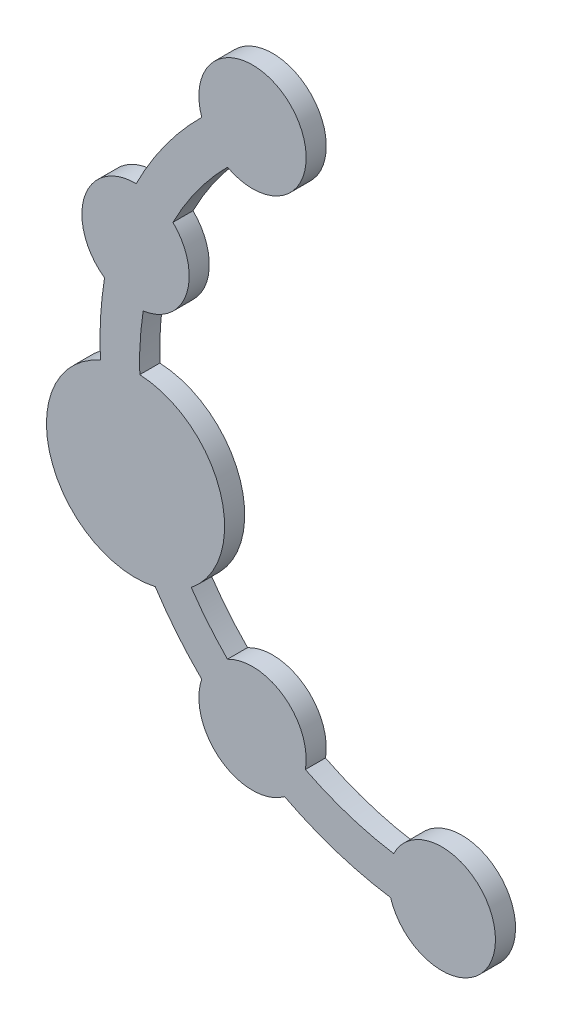
ISO-10303-21;
HEADER;
FILE_DESCRIPTION(('STEP AP214'),'2;1');
FILE_NAME('part.step','',(''),(''),'','','');
FILE_SCHEMA(('AUTOMOTIVE_DESIGN { 1 0 10303 214 1 1 1 1 }'));
ENDSEC;
DATA;
#1=APPLICATION_CONTEXT('core data for automotive mechanical design processes');
#2=APPLICATION_PROTOCOL_DEFINITION('international standard','automotive_design',2000,#1);
#3=PRODUCT_CONTEXT('',#1,'mechanical');
#4=PRODUCT('Part','Part','',(#3));
#5=PRODUCT_RELATED_PRODUCT_CATEGORY('part','',(#4));
#6=PRODUCT_DEFINITION_FORMATION('','',#4);
#7=PRODUCT_DEFINITION_CONTEXT('part definition',#1,'design');
#8=PRODUCT_DEFINITION('design','',#6,#7);
#9=PRODUCT_DEFINITION_SHAPE('','',#8);
#10=(LENGTH_UNIT() NAMED_UNIT(*) SI_UNIT(.MILLI.,.METRE.));
#11=(NAMED_UNIT(*) PLANE_ANGLE_UNIT() SI_UNIT($,.RADIAN.));
#12=(NAMED_UNIT(*) SI_UNIT($,.STERADIAN.) SOLID_ANGLE_UNIT());
#13=UNCERTAINTY_MEASURE_WITH_UNIT(LENGTH_MEASURE(1.E-05),#10,'distance_accuracy_value','');
#14=(GEOMETRIC_REPRESENTATION_CONTEXT(3) GLOBAL_UNCERTAINTY_ASSIGNED_CONTEXT((#13)) GLOBAL_UNIT_ASSIGNED_CONTEXT((#10,
#11,#12)) REPRESENTATION_CONTEXT('',''));
#15=CARTESIAN_POINT('',(0.,0.,0.));
#16=DIRECTION('',(0.,0.,1.));
#17=DIRECTION('',(1.,0.,0.));
#18=AXIS2_PLACEMENT_3D('',#15,#16,#17);
#19=CARTESIAN_POINT('',(0.,0.,0.));
#20=DIRECTION('',(0.,0.,1.));
#21=DIRECTION('',(1.,0.,0.));
#22=AXIS2_PLACEMENT_3D('',#19,#20,#21);
#23=CYLINDRICAL_SURFACE('',#22,30.5299999999999);
#24=CARTESIAN_POINT('',(0.,0.,0.));
#25=DIRECTION('',(0.,0.,-1.));
#26=DIRECTION('',(-1.,0.,0.));
#27=AXIS2_PLACEMENT_3D('',#24,#25,#26);
#28=CIRCLE('',#27,30.5299999999999);
#29=CARTESIAN_POINT('',(-27.1615635298566,13.9402427028211,0.));
#30=VERTEX_POINT('',#29);
#31=CARTESIAN_POINT('',(-21.6513433857743,21.5244100869521,0.));
#32=VERTEX_POINT('',#31);
#33=EDGE_CURVE('E188',#30,#32,#28,.T.);
#34=ORIENTED_EDGE('',*,*,#33,.T.);
#35=DIRECTION('',(0.,0.,-1.));
#36=VECTOR('',#35,1.);
#37=CARTESIAN_POINT('',(-21.6513433857743,21.5244100869521,1.015));
#38=LINE('',#37,#36);
#39=CARTESIAN_POINT('',(-21.6513433857743,21.5244100869521,2.03));
#40=VERTEX_POINT('',#39);
#41=EDGE_CURVE('E49',#32,#40,#38,.F.);
#42=ORIENTED_EDGE('',*,*,#41,.T.);
#43=CARTESIAN_POINT('',(0.,0.,2.03));
#44=DIRECTION('',(0.,0.,-1.));
#45=DIRECTION('',(-1.,0.,0.));
#46=AXIS2_PLACEMENT_3D('',#43,#44,#45);
#47=CIRCLE('',#46,30.5299999999999);
#48=CARTESIAN_POINT('',(-27.1615635298566,13.9402427028211,2.03));
#49=VERTEX_POINT('',#48);
#50=EDGE_CURVE('E173',#49,#40,#47,.T.);
#51=ORIENTED_EDGE('',*,*,#50,.F.);
#52=DIRECTION('',(0.,0.,-1.));
#53=VECTOR('',#52,1.);
#54=CARTESIAN_POINT('',(-27.1615635298566,13.9402427028211,1.015));
#55=LINE('',#54,#53);
#56=EDGE_CURVE('E208',#49,#30,#55,.T.);
#57=ORIENTED_EDGE('',*,*,#56,.T.);
#58=EDGE_LOOP('',(#34,#42,#51,#57));
#59=FACE_BOUND('',#58,.T.);
#60=ADVANCED_FACE('F34',(#59),#23,.F.);
#61=CARTESIAN_POINT('',(0.,0.,0.));
#62=DIRECTION('',(0.,0.,1.));
#63=DIRECTION('',(1.,0.,0.));
#64=AXIS2_PLACEMENT_3D('',#61,#62,#63);
#65=CYLINDRICAL_SURFACE('',#64,34.5300000000001);
#66=CARTESIAN_POINT('',(0.,0.,2.03));
#67=DIRECTION('',(0.,0.,1.));
#68=DIRECTION('',(-1.,0.,0.));
#69=AXIS2_PLACEMENT_3D('',#66,#67,#68);
#70=CIRCLE('',#69,34.5300000000001);
#71=CARTESIAN_POINT('',(-24.2539232103897,24.5777970718396,2.03));
#72=VERTEX_POINT('',#71);
#73=CARTESIAN_POINT('',(-30.8697485136282,15.4718947354664,2.03));
#74=VERTEX_POINT('',#73);
#75=EDGE_CURVE('E57',#72,#74,#70,.T.);
#76=ORIENTED_EDGE('',*,*,#75,.F.);
#77=DIRECTION('',(0.,0.,-1.));
#78=VECTOR('',#77,1.);
#79=CARTESIAN_POINT('',(-24.2539232103896,24.5777970718396,1.015));
#80=LINE('',#79,#78);
#81=CARTESIAN_POINT('',(-24.2539232103897,24.5777970718396,0.));
#82=VERTEX_POINT('',#81);
#83=EDGE_CURVE('E280',#72,#82,#80,.T.);
#84=ORIENTED_EDGE('',*,*,#83,.T.);
#85=CARTESIAN_POINT('',(0.,0.,0.));
#86=DIRECTION('',(0.,0.,1.));
#87=DIRECTION('',(-1.,0.,0.));
#88=AXIS2_PLACEMENT_3D('',#85,#86,#87);
#89=CIRCLE('',#88,34.5300000000001);
#90=CARTESIAN_POINT('',(-30.8697485136282,15.4718947354664,0.));
#91=VERTEX_POINT('',#90);
#92=EDGE_CURVE('E232',#82,#91,#89,.T.);
#93=ORIENTED_EDGE('',*,*,#92,.T.);
#94=DIRECTION('',(0.,0.,-1.));
#95=VECTOR('',#94,1.);
#96=CARTESIAN_POINT('',(-30.8697485136282,15.4718947354664,1.015));
#97=LINE('',#96,#95);
#98=EDGE_CURVE('E209',#91,#74,#97,.F.);
#99=ORIENTED_EDGE('',*,*,#98,.T.);
#100=EDGE_LOOP('',(#76,#84,#93,#99));
#101=FACE_BOUND('',#100,.T.);
#102=ADVANCED_FACE('F296',(#101),#65,.T.);
#103=DIRECTION('',(0.,0.,1.));
#104=VECTOR('',#103,1.);
#105=CARTESIAN_POINT('',(-30.5115084468974,-1.06242754807366,1.015));
#106=LINE('',#105,#104);
#107=CARTESIAN_POINT('',(-30.5115084468974,-1.06242754807366,0.));
#108=VERTEX_POINT('',#107);
#109=CARTESIAN_POINT('',(-30.5115084468974,-1.06242754807366,2.03));
#110=VERTEX_POINT('',#109);
#111=EDGE_CURVE('E146',#108,#110,#106,.T.);
#112=ORIENTED_EDGE('',*,*,#111,.F.);
#113=CARTESIAN_POINT('',(-30.1680355635448,4.68727321976142,0.));
#114=VERTEX_POINT('',#113);
#115=EDGE_CURVE('E231',#108,#114,#28,.T.);
#116=ORIENTED_EDGE('',*,*,#115,.T.);
#117=DIRECTION('',(0.,0.,-1.));
#118=VECTOR('',#117,1.);
#119=CARTESIAN_POINT('',(-30.1680355635448,4.68727321976142,1.015));
#120=LINE('',#119,#118);
#121=CARTESIAN_POINT('',(-30.1680355635448,4.68727321976142,2.03));
#122=VERTEX_POINT('',#121);
#123=EDGE_CURVE('E171',#114,#122,#120,.F.);
#124=ORIENTED_EDGE('',*,*,#123,.T.);
#125=EDGE_CURVE('E163',#110,#122,#47,.T.);
#126=ORIENTED_EDGE('',*,*,#125,.F.);
#127=EDGE_LOOP('',(#112,#116,#124,#126));
#128=FACE_BOUND('',#127,.T.);
#129=ADVANCED_FACE('F169',(#128),#23,.F.);
#130=DIRECTION('',(0.,0.,1.));
#131=VECTOR('',#130,1.);
#132=CARTESIAN_POINT('',(-34.4840691166106,-1.78041488446718,1.015));
#133=LINE('',#132,#131);
#134=CARTESIAN_POINT('',(-34.4840691166106,-1.78041488446718,2.03));
#135=VERTEX_POINT('',#134);
#136=CARTESIAN_POINT('',(-34.4840691166106,-1.78041488446718,0.));
#137=VERTEX_POINT('',#136);
#138=EDGE_CURVE('E157',#135,#137,#133,.F.);
#139=ORIENTED_EDGE('',*,*,#138,.F.);
#140=CARTESIAN_POINT('',(-34.0683027101347,5.62775714211587,2.03));
#141=VERTEX_POINT('',#140);
#142=EDGE_CURVE('E184',#141,#135,#70,.T.);
#143=ORIENTED_EDGE('',*,*,#142,.F.);
#144=DIRECTION('',(0.,0.,-1.));
#145=VECTOR('',#144,1.);
#146=CARTESIAN_POINT('',(-34.0683027101347,5.6277571421159,1.015));
#147=LINE('',#146,#145);
#148=CARTESIAN_POINT('',(-34.0683027101347,5.6277571421159,0.));
#149=VERTEX_POINT('',#148);
#150=EDGE_CURVE('E201',#141,#149,#147,.T.);
#151=ORIENTED_EDGE('',*,*,#150,.T.);
#152=EDGE_CURVE('E234',#149,#137,#89,.T.);
#153=ORIENTED_EDGE('',*,*,#152,.T.);
#154=EDGE_LOOP('',(#139,#143,#151,#153));
#155=FACE_BOUND('',#154,.T.);
#156=ADVANCED_FACE('F199',(#155),#65,.T.);
#157=DIRECTION('',(0.,0.,1.));
#158=VECTOR('',#157,1.);
#159=CARTESIAN_POINT('',(-25.3088081019418,-17.0746927485997,1.015));
#160=LINE('',#159,#158);
#161=CARTESIAN_POINT('',(-25.3088081019418,-17.0746927485997,2.03));
#162=VERTEX_POINT('',#161);
#163=CARTESIAN_POINT('',(-25.3088081019418,-17.0746927485997,0.));
#164=VERTEX_POINT('',#163);
#165=EDGE_CURVE('E272',#162,#164,#160,.F.);
#166=ORIENTED_EDGE('',*,*,#165,.F.);
#167=CARTESIAN_POINT('',(-21.6513433857744,-21.5244100869519,2.03));
#168=VERTEX_POINT('',#167);
#169=EDGE_CURVE('E166',#168,#162,#47,.T.);
#170=ORIENTED_EDGE('',*,*,#169,.F.);
#171=DIRECTION('',(0.,0.,-1.));
#172=VECTOR('',#171,1.);
#173=CARTESIAN_POINT('',(-21.6513433857744,-21.5244100869519,1.015));
#174=LINE('',#173,#172);
#175=CARTESIAN_POINT('',(-21.6513433857744,-21.5244100869519,0.));
#176=VERTEX_POINT('',#175);
#177=EDGE_CURVE('E224',#168,#176,#174,.T.);
#178=ORIENTED_EDGE('',*,*,#177,.T.);
#179=EDGE_CURVE('E230',#176,#164,#28,.T.);
#180=ORIENTED_EDGE('',*,*,#179,.T.);
#181=EDGE_LOOP('',(#166,#170,#178,#180));
#182=FACE_BOUND('',#181,.T.);
#183=ADVANCED_FACE('F304',(#182),#23,.F.);
#184=DIRECTION('',(0.,0.,1.));
#185=VECTOR('',#184,1.);
#186=CARTESIAN_POINT('',(-28.9446995625901,-18.8288413672058,1.015));
#187=LINE('',#186,#185);
#188=CARTESIAN_POINT('',(-28.9446995625901,-18.8288413672058,0.));
#189=VERTEX_POINT('',#188);
#190=CARTESIAN_POINT('',(-28.9446995625901,-18.8288413672058,2.03));
#191=VERTEX_POINT('',#190);
#192=EDGE_CURVE('E270',#189,#191,#187,.T.);
#193=ORIENTED_EDGE('',*,*,#192,.F.);
#194=CARTESIAN_POINT('',(-24.2539232103898,-24.5777970718395,0.));
#195=VERTEX_POINT('',#194);
#196=EDGE_CURVE('E235',#189,#195,#89,.T.);
#197=ORIENTED_EDGE('',*,*,#196,.T.);
#198=DIRECTION('',(0.,0.,-1.));
#199=VECTOR('',#198,1.);
#200=CARTESIAN_POINT('',(-24.2539232103898,-24.5777970718395,1.015));
#201=LINE('',#200,#199);
#202=CARTESIAN_POINT('',(-24.2539232103898,-24.5777970718395,2.03));
#203=VERTEX_POINT('',#202);
#204=EDGE_CURVE('E42',#195,#203,#201,.F.);
#205=ORIENTED_EDGE('',*,*,#204,.T.);
#206=EDGE_CURVE('E183',#191,#203,#70,.T.);
#207=ORIENTED_EDGE('',*,*,#206,.F.);
#208=EDGE_LOOP('',(#193,#197,#205,#207));
#209=FACE_BOUND('',#208,.T.);
#210=ADVANCED_FACE('F263',(#209),#65,.T.);
#211=CARTESIAN_POINT('',(-4.86457393673341,-30.1399538887181,0.));
#212=VERTEX_POINT('',#211);
#213=CARTESIAN_POINT('',(-13.7802974153529,-27.2430597243484,0.));
#214=VERTEX_POINT('',#213);
#215=EDGE_CURVE('E228',#212,#214,#28,.T.);
#216=ORIENTED_EDGE('',*,*,#215,.T.);
#217=DIRECTION('',(0.,0.,-1.));
#218=VECTOR('',#217,1.);
#219=CARTESIAN_POINT('',(-13.7802974153529,-27.2430597243484,1.015));
#220=LINE('',#219,#218);
#221=CARTESIAN_POINT('',(-13.7802974153529,-27.2430597243484,2.03));
#222=VERTEX_POINT('',#221);
#223=EDGE_CURVE('E176',#214,#222,#220,.F.);
#224=ORIENTED_EDGE('',*,*,#223,.T.);
#225=CARTESIAN_POINT('',(-4.86457393673341,-30.1399538887181,2.03));
#226=VERTEX_POINT('',#225);
#227=EDGE_CURVE('E175',#226,#222,#47,.T.);
#228=ORIENTED_EDGE('',*,*,#227,.F.);
#229=DIRECTION('',(0.,0.,1.));
#230=VECTOR('',#229,1.);
#231=CARTESIAN_POINT('',(-4.86457393673341,-30.1399538887181,1.015));
#232=LINE('',#231,#230);
#233=EDGE_CURVE('E238',#212,#226,#232,.T.);
#234=ORIENTED_EDGE('',*,*,#233,.F.);
#235=EDGE_LOOP('',(#216,#224,#228,#234));
#236=FACE_BOUND('',#235,.T.);
#237=ADVANCED_FACE('F305',(#236),#23,.F.);
#238=CARTESIAN_POINT('',(-15.8799996090775,-30.6618086944607,2.03));
#239=VERTEX_POINT('',#238);
#240=CARTESIAN_POINT('',(-5.17536940480592,-34.1399538887182,2.03));
#241=VERTEX_POINT('',#240);
#242=EDGE_CURVE('E180',#239,#241,#70,.T.);
#243=ORIENTED_EDGE('',*,*,#242,.F.);
#244=DIRECTION('',(0.,0.,-1.));
#245=VECTOR('',#244,1.);
#246=CARTESIAN_POINT('',(-15.8799996090775,-30.6618086944606,1.015));
#247=LINE('',#246,#245);
#248=CARTESIAN_POINT('',(-15.8799996090775,-30.6618086944607,0.));
#249=VERTEX_POINT('',#248);
#250=EDGE_CURVE('E11',#239,#249,#247,.T.);
#251=ORIENTED_EDGE('',*,*,#250,.T.);
#252=CARTESIAN_POINT('',(-5.17536940480592,-34.1399538887182,0.));
#253=VERTEX_POINT('',#252);
#254=EDGE_CURVE('E229',#249,#253,#89,.T.);
#255=ORIENTED_EDGE('',*,*,#254,.T.);
#256=DIRECTION('',(0.,0.,1.));
#257=VECTOR('',#256,1.);
#258=CARTESIAN_POINT('',(-5.17536940480592,-34.1399538887182,1.015));
#259=LINE('',#258,#257);
#260=EDGE_CURVE('E233',#241,#253,#259,.F.);
#261=ORIENTED_EDGE('',*,*,#260,.F.);
#262=EDGE_LOOP('',(#243,#251,#255,#261));
#263=FACE_BOUND('',#262,.T.);
#264=ADVANCED_FACE('F240',(#263),#65,.T.);
#265=CARTESIAN_POINT('',(0.,-32.53,2.03));
#266=DIRECTION('',(0.,0.,-1.));
#267=DIRECTION('',(-1.,0.,0.));
#268=AXIS2_PLACEMENT_3D('',#265,#266,#267);
#269=CYLINDRICAL_SURFACE('',#268,5.42);
#270=CARTESIAN_POINT('',(0.,-32.53,0.));
#271=DIRECTION('',(0.,0.,1.));
#272=DIRECTION('',(1.,0.,0.));
#273=AXIS2_PLACEMENT_3D('',#270,#271,#272);
#274=CIRCLE('',#273,5.42);
#275=EDGE_CURVE('E250',#253,#212,#274,.T.);
#276=ORIENTED_EDGE('',*,*,#275,.T.);
#277=ORIENTED_EDGE('',*,*,#233,.T.);
#278=CARTESIAN_POINT('',(0.,-32.53,2.03));
#279=DIRECTION('',(0.,0.,1.));
#280=DIRECTION('',(1.,0.,0.));
#281=AXIS2_PLACEMENT_3D('',#278,#279,#280);
#282=CIRCLE('',#281,5.42);
#283=EDGE_CURVE('E251',#241,#226,#282,.T.);
#284=ORIENTED_EDGE('',*,*,#283,.F.);
#285=ORIENTED_EDGE('',*,*,#260,.T.);
#286=EDGE_LOOP('',(#276,#277,#284,#285));
#287=FACE_BOUND('',#286,.T.);
#288=ADVANCED_FACE('F36',(#287),#269,.T.);
#289=CARTESIAN_POINT('',(0.,-32.53,2.03));
#290=DIRECTION('',(0.,0.,1.));
#291=DIRECTION('',(1.,0.,0.));
#292=AXIS2_PLACEMENT_3D('',#289,#290,#291);
#293=PLANE('',#292);
#294=CARTESIAN_POINT('',(-30.9378684750814,-10.052322827017,2.03));
#295=DIRECTION('',(0.,0.,1.));
#296=DIRECTION('',(1.,0.,0.));
#297=AXIS2_PLACEMENT_3D('',#294,#295,#296);
#298=CIRCLE('',#297,9.);
#299=EDGE_CURVE('E149',#162,#110,#298,.T.);
#300=ORIENTED_EDGE('',*,*,#299,.T.);
#301=ORIENTED_EDGE('',*,*,#125,.T.);
#302=CARTESIAN_POINT('',(-30.9378684750813,10.0523228270172,2.03));
#303=DIRECTION('',(0.,0.,1.));
#304=DIRECTION('',(1.,0.,0.));
#305=AXIS2_PLACEMENT_3D('',#302,#303,#304);
#306=CIRCLE('',#305,5.41999999999999);
#307=EDGE_CURVE('E286',#122,#49,#306,.T.);
#308=ORIENTED_EDGE('',*,*,#307,.T.);
#309=ORIENTED_EDGE('',*,*,#50,.T.);
#310=CARTESIAN_POINT('',(-19.120654257074,26.3173228270172,2.03));
#311=DIRECTION('',(0.,0.,1.));
#312=DIRECTION('',(1.,0.,0.));
#313=AXIS2_PLACEMENT_3D('',#310,#311,#312);
#314=CIRCLE('',#313,5.41999999999999);
#315=EDGE_CURVE('E277',#40,#72,#314,.T.);
#316=ORIENTED_EDGE('',*,*,#315,.T.);
#317=ORIENTED_EDGE('',*,*,#75,.T.);
#318=EDGE_CURVE('E194',#74,#141,#306,.T.);
#319=ORIENTED_EDGE('',*,*,#318,.T.);
#320=ORIENTED_EDGE('',*,*,#142,.T.);
#321=EDGE_CURVE('E167',#135,#191,#298,.T.);
#322=ORIENTED_EDGE('',*,*,#321,.T.);
#323=ORIENTED_EDGE('',*,*,#206,.T.);
#324=CARTESIAN_POINT('',(-19.1206542570742,-26.317322827017,2.03));
#325=DIRECTION('',(0.,0.,1.));
#326=DIRECTION('',(1.,0.,0.));
#327=AXIS2_PLACEMENT_3D('',#324,#325,#326);
#328=CIRCLE('',#327,5.41999999999999);
#329=EDGE_CURVE('E220',#203,#239,#328,.T.);
#330=ORIENTED_EDGE('',*,*,#329,.T.);
#331=ORIENTED_EDGE('',*,*,#242,.T.);
#332=ORIENTED_EDGE('',*,*,#283,.T.);
#333=ORIENTED_EDGE('',*,*,#227,.T.);
#334=EDGE_CURVE('E218',#222,#168,#328,.T.);
#335=ORIENTED_EDGE('',*,*,#334,.T.);
#336=ORIENTED_EDGE('',*,*,#169,.T.);
#337=EDGE_LOOP('',(#300,#301,#308,#309,#316,#317,#319,#320,#322,#323,#330,#331,#332,#333,#335,#336));
#338=FACE_BOUND('',#337,.T.);
#339=ADVANCED_FACE('F161',(#338),#293,.T.);
#340=CARTESIAN_POINT('',(0.,-32.53,0.));
#341=DIRECTION('',(0.,0.,1.));
#342=DIRECTION('',(1.,0.,0.));
#343=AXIS2_PLACEMENT_3D('',#340,#341,#342);
#344=PLANE('',#343);
#345=ORIENTED_EDGE('',*,*,#115,.F.);
#346=CARTESIAN_POINT('',(-30.9378684750814,-10.052322827017,0.));
#347=DIRECTION('',(0.,0.,1.));
#348=DIRECTION('',(1.,0.,0.));
#349=AXIS2_PLACEMENT_3D('',#346,#347,#348);
#350=CIRCLE('',#349,9.);
#351=EDGE_CURVE('E152',#164,#108,#350,.T.);
#352=ORIENTED_EDGE('',*,*,#351,.F.);
#353=ORIENTED_EDGE('',*,*,#179,.F.);
#354=CARTESIAN_POINT('',(-19.1206542570742,-26.317322827017,0.));
#355=DIRECTION('',(0.,0.,1.));
#356=DIRECTION('',(1.,0.,0.));
#357=AXIS2_PLACEMENT_3D('',#354,#355,#356);
#358=CIRCLE('',#357,5.41999999999999);
#359=EDGE_CURVE('E217',#214,#176,#358,.T.);
#360=ORIENTED_EDGE('',*,*,#359,.F.);
#361=ORIENTED_EDGE('',*,*,#215,.F.);
#362=ORIENTED_EDGE('',*,*,#275,.F.);
#363=ORIENTED_EDGE('',*,*,#254,.F.);
#364=EDGE_CURVE('E221',#195,#249,#358,.T.);
#365=ORIENTED_EDGE('',*,*,#364,.F.);
#366=ORIENTED_EDGE('',*,*,#196,.F.);
#367=EDGE_CURVE('E268',#137,#189,#350,.T.);
#368=ORIENTED_EDGE('',*,*,#367,.F.);
#369=ORIENTED_EDGE('',*,*,#152,.F.);
#370=CARTESIAN_POINT('',(-30.9378684750813,10.0523228270172,0.));
#371=DIRECTION('',(0.,0.,1.));
#372=DIRECTION('',(1.,0.,0.));
#373=AXIS2_PLACEMENT_3D('',#370,#371,#372);
#374=CIRCLE('',#373,5.41999999999999);
#375=EDGE_CURVE('E207',#91,#149,#374,.T.);
#376=ORIENTED_EDGE('',*,*,#375,.F.);
#377=ORIENTED_EDGE('',*,*,#92,.F.);
#378=CARTESIAN_POINT('',(-19.120654257074,26.3173228270172,0.));
#379=DIRECTION('',(0.,0.,1.));
#380=DIRECTION('',(1.,0.,0.));
#381=AXIS2_PLACEMENT_3D('',#378,#379,#380);
#382=CIRCLE('',#381,5.41999999999999);
#383=EDGE_CURVE('E156',#32,#82,#382,.T.);
#384=ORIENTED_EDGE('',*,*,#383,.F.);
#385=ORIENTED_EDGE('',*,*,#33,.F.);
#386=EDGE_CURVE('E285',#114,#30,#374,.T.);
#387=ORIENTED_EDGE('',*,*,#386,.F.);
#388=EDGE_LOOP('',(#345,#352,#353,#360,#361,#362,#363,#365,#366,#368,#369,#376,#377,#384,#385,#387));
#389=FACE_BOUND('',#388,.T.);
#390=ADVANCED_FACE('F253',(#389),#344,.F.);
#391=CARTESIAN_POINT('',(-19.1206542570742,-26.317322827017,2.03));
#392=DIRECTION('',(0.,0.,-1.));
#393=DIRECTION('',(-1.,0.,0.));
#394=AXIS2_PLACEMENT_3D('',#391,#392,#393);
#395=CYLINDRICAL_SURFACE('',#394,5.41999999999999);
#396=ORIENTED_EDGE('',*,*,#250,.F.);
#397=ORIENTED_EDGE('',*,*,#329,.F.);
#398=ORIENTED_EDGE('',*,*,#204,.F.);
#399=ORIENTED_EDGE('',*,*,#364,.T.);
#400=EDGE_LOOP('',(#396,#397,#398,#399));
#401=FACE_BOUND('',#400,.T.);
#402=ADVANCED_FACE('F266',(#401),#395,.T.);
#403=ORIENTED_EDGE('',*,*,#223,.F.);
#404=ORIENTED_EDGE('',*,*,#359,.T.);
#405=ORIENTED_EDGE('',*,*,#177,.F.);
#406=ORIENTED_EDGE('',*,*,#334,.F.);
#407=EDGE_LOOP('',(#403,#404,#405,#406));
#408=FACE_BOUND('',#407,.T.);
#409=ADVANCED_FACE('F327',(#408),#395,.T.);
#410=CARTESIAN_POINT('',(-30.9378684750813,10.0523228270172,2.03));
#411=DIRECTION('',(0.,0.,-1.));
#412=DIRECTION('',(-1.,0.,0.));
#413=AXIS2_PLACEMENT_3D('',#410,#411,#412);
#414=CYLINDRICAL_SURFACE('',#413,5.41999999999999);
#415=ORIENTED_EDGE('',*,*,#150,.F.);
#416=ORIENTED_EDGE('',*,*,#318,.F.);
#417=ORIENTED_EDGE('',*,*,#98,.F.);
#418=ORIENTED_EDGE('',*,*,#375,.T.);
#419=EDGE_LOOP('',(#415,#416,#417,#418));
#420=FACE_BOUND('',#419,.T.);
#421=ADVANCED_FACE('F204',(#420),#414,.T.);
#422=ORIENTED_EDGE('',*,*,#123,.F.);
#423=ORIENTED_EDGE('',*,*,#386,.T.);
#424=ORIENTED_EDGE('',*,*,#56,.F.);
#425=ORIENTED_EDGE('',*,*,#307,.F.);
#426=EDGE_LOOP('',(#422,#423,#424,#425));
#427=FACE_BOUND('',#426,.T.);
#428=ADVANCED_FACE('F291',(#427),#414,.T.);
#429=CARTESIAN_POINT('',(-19.120654257074,26.3173228270172,2.03));
#430=DIRECTION('',(0.,0.,-1.));
#431=DIRECTION('',(-1.,0.,0.));
#432=AXIS2_PLACEMENT_3D('',#429,#430,#431);
#433=CYLINDRICAL_SURFACE('',#432,5.41999999999999);
#434=ORIENTED_EDGE('',*,*,#41,.F.);
#435=ORIENTED_EDGE('',*,*,#383,.T.);
#436=ORIENTED_EDGE('',*,*,#83,.F.);
#437=ORIENTED_EDGE('',*,*,#315,.F.);
#438=EDGE_LOOP('',(#434,#435,#436,#437));
#439=FACE_BOUND('',#438,.T.);
#440=ADVANCED_FACE('F295',(#439),#433,.T.);
#441=CARTESIAN_POINT('',(-30.9378684750814,-10.052322827017,0.));
#442=DIRECTION('',(0.,0.,1.));
#443=DIRECTION('',(1.,0.,0.));
#444=AXIS2_PLACEMENT_3D('',#441,#442,#443);
#445=CYLINDRICAL_SURFACE('',#444,9.);
#446=ORIENTED_EDGE('',*,*,#351,.T.);
#447=ORIENTED_EDGE('',*,*,#111,.T.);
#448=ORIENTED_EDGE('',*,*,#299,.F.);
#449=ORIENTED_EDGE('',*,*,#165,.T.);
#450=EDGE_LOOP('',(#446,#447,#448,#449));
#451=FACE_BOUND('',#450,.T.);
#452=ADVANCED_FACE('F148',(#451),#445,.T.);
#453=ORIENTED_EDGE('',*,*,#321,.F.);
#454=ORIENTED_EDGE('',*,*,#138,.T.);
#455=ORIENTED_EDGE('',*,*,#367,.T.);
#456=ORIENTED_EDGE('',*,*,#192,.T.);
#457=EDGE_LOOP('',(#453,#454,#455,#456));
#458=FACE_BOUND('',#457,.T.);
#459=ADVANCED_FACE('F337',(#458),#445,.T.);
#460=CLOSED_SHELL('',(#60,#102,#129,#156,#183,#210,#237,#264,#288,#339,#390,#402,#409,#421,#428,
#440,#452,#459));
#461=MANIFOLD_SOLID_BREP('B2',#460);
#462=ADVANCED_BREP_SHAPE_REPRESENTATION('',(#18,#461),#14);
#463=SHAPE_DEFINITION_REPRESENTATION(#9,#462);
ENDSEC;
END-ISO-10303-21;
